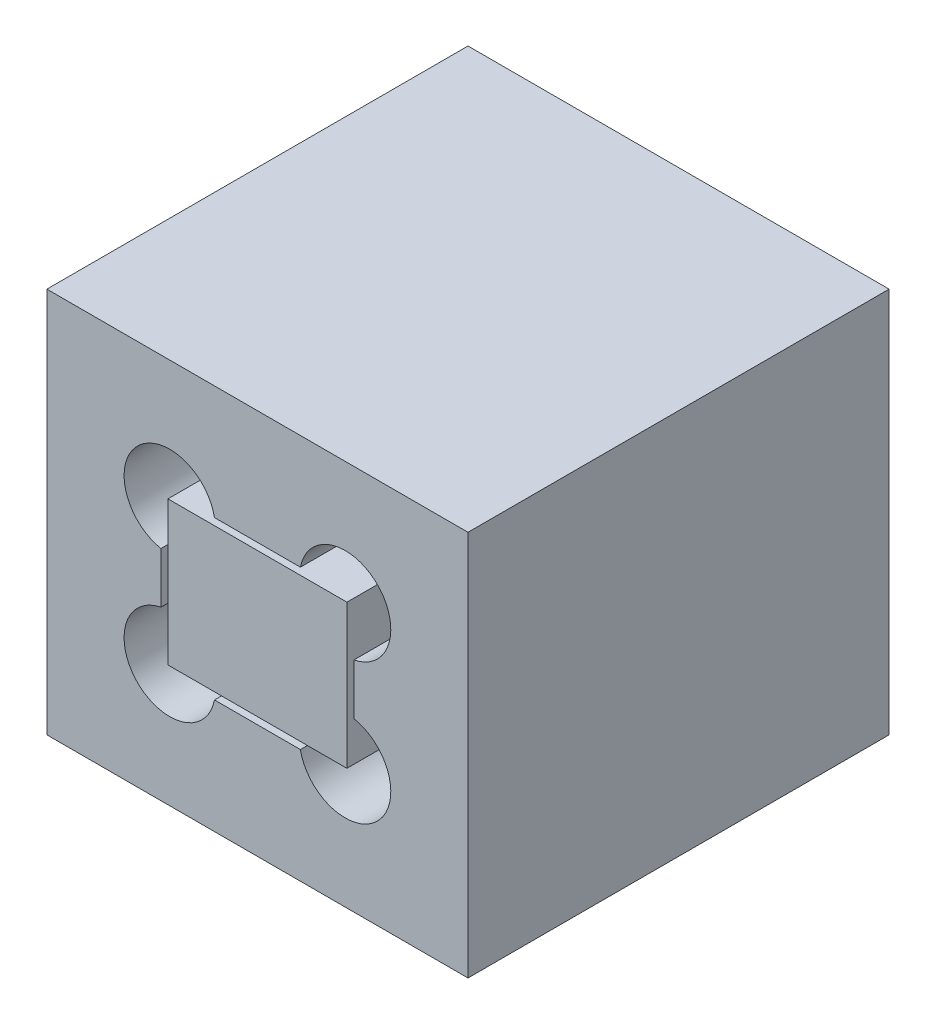
ISO-10303-21;
HEADER;
FILE_DESCRIPTION(('STEP AP214'),'2;1');
FILE_NAME('part.step','',(''),(''),'','','');
FILE_SCHEMA(('AUTOMOTIVE_DESIGN { 1 0 10303 214 1 1 1 1 }'));
ENDSEC;
DATA;
#1=APPLICATION_CONTEXT('core data for automotive mechanical design processes');
#2=APPLICATION_PROTOCOL_DEFINITION('international standard','automotive_design',2000,#1);
#3=PRODUCT_CONTEXT('',#1,'mechanical');
#4=PRODUCT('Part','Part','',(#3));
#5=PRODUCT_RELATED_PRODUCT_CATEGORY('part','',(#4));
#6=PRODUCT_DEFINITION_FORMATION('','',#4);
#7=PRODUCT_DEFINITION_CONTEXT('part definition',#1,'design');
#8=PRODUCT_DEFINITION('design','',#6,#7);
#9=PRODUCT_DEFINITION_SHAPE('','',#8);
#10=(LENGTH_UNIT() NAMED_UNIT(*) SI_UNIT(.MILLI.,.METRE.));
#11=(NAMED_UNIT(*) PLANE_ANGLE_UNIT() SI_UNIT($,.RADIAN.));
#12=(NAMED_UNIT(*) SI_UNIT($,.STERADIAN.) SOLID_ANGLE_UNIT());
#13=UNCERTAINTY_MEASURE_WITH_UNIT(LENGTH_MEASURE(1.E-05),#10,'distance_accuracy_value','');
#14=(GEOMETRIC_REPRESENTATION_CONTEXT(3) GLOBAL_UNCERTAINTY_ASSIGNED_CONTEXT((#13)) GLOBAL_UNIT_ASSIGNED_CONTEXT((#10,
#11,#12)) REPRESENTATION_CONTEXT('',''));
#15=CARTESIAN_POINT('',(0.,0.,0.));
#16=DIRECTION('',(0.,0.,1.));
#17=DIRECTION('',(1.,0.,0.));
#18=AXIS2_PLACEMENT_3D('',#15,#16,#17);
#19=CARTESIAN_POINT('',(3.49999999999996,7.49999999999999,9.50000000000001));
#20=DIRECTION('',(0.,0.,-1.));
#21=DIRECTION('',(-1.,0.,0.));
#22=AXIS2_PLACEMENT_3D('',#19,#20,#21);
#23=PLANE('',#22);
#24=CARTESIAN_POINT('',(3.49999999999996,7.49999999999999,9.50000000000001));
#25=DIRECTION('',(0.,0.,1.));
#26=DIRECTION('',(-1.,0.,0.));
#27=AXIS2_PLACEMENT_3D('',#24,#25,#26);
#28=CIRCLE('',#27,1.3);
#29=CARTESIAN_POINT('',(4.77573508221732,7.74999999999999,9.50000000000001));
#30=VERTEX_POINT('',#29);
#31=CARTESIAN_POINT('',(3.24999999999999,6.22426491778267,9.49999999999998));
#32=VERTEX_POINT('',#31);
#33=EDGE_CURVE('E202',#30,#32,#28,.T.);
#34=ORIENTED_EDGE('',*,*,#33,.T.);
#35=DIRECTION('',(0.,-1.,0.));
#36=VECTOR('',#35,1.);
#37=CARTESIAN_POINT('',(3.24999999999999,4.77573508221731,9.49999999999999));
#38=LINE('',#37,#36);
#39=CARTESIAN_POINT('',(3.24999999999999,4.77573508221731,9.49999999999999));
#40=VERTEX_POINT('',#39);
#41=EDGE_CURVE('E205',#32,#40,#38,.T.);
#42=ORIENTED_EDGE('',*,*,#41,.T.);
#43=CARTESIAN_POINT('',(3.49999999999998,3.5,9.50000000000001));
#44=DIRECTION('',(0.,0.,1.));
#45=DIRECTION('',(1.,0.,0.));
#46=AXIS2_PLACEMENT_3D('',#43,#44,#45);
#47=CIRCLE('',#46,1.3);
#48=CARTESIAN_POINT('',(4.77573508221732,3.24999999999999,9.49999999999999));
#49=VERTEX_POINT('',#48);
#50=EDGE_CURVE('E208',#40,#49,#47,.T.);
#51=ORIENTED_EDGE('',*,*,#50,.T.);
#52=DIRECTION('',(1.,0.,0.));
#53=VECTOR('',#52,1.);
#54=CARTESIAN_POINT('',(7.22426491778269,3.24999999999999,9.49999999999998));
#55=LINE('',#54,#53);
#56=CARTESIAN_POINT('',(7.22426491778269,3.24999999999999,9.49999999999998));
#57=VERTEX_POINT('',#56);
#58=EDGE_CURVE('E211',#49,#57,#55,.T.);
#59=ORIENTED_EDGE('',*,*,#58,.T.);
#60=CARTESIAN_POINT('',(8.49999999999999,3.49999999999999,9.50000000000001));
#61=DIRECTION('',(0.,0.,1.));
#62=DIRECTION('',(-1.,0.,0.));
#63=AXIS2_PLACEMENT_3D('',#60,#61,#62);
#64=CIRCLE('',#63,1.3);
#65=CARTESIAN_POINT('',(8.74999999999999,4.77573508221731,9.50000000000001));
#66=VERTEX_POINT('',#65);
#67=EDGE_CURVE('E214',#57,#66,#64,.T.);
#68=ORIENTED_EDGE('',*,*,#67,.T.);
#69=DIRECTION('',(0.,1.,0.));
#70=VECTOR('',#69,1.);
#71=CARTESIAN_POINT('',(8.74999999999998,6.22426491778268,9.49999999999997));
#72=LINE('',#71,#70);
#73=CARTESIAN_POINT('',(8.74999999999998,6.22426491778268,9.49999999999997));
#74=VERTEX_POINT('',#73);
#75=EDGE_CURVE('E217',#66,#74,#72,.T.);
#76=ORIENTED_EDGE('',*,*,#75,.T.);
#77=CARTESIAN_POINT('',(8.50000000000001,7.49999999999999,9.49999999999999));
#78=DIRECTION('',(0.,0.,1.));
#79=DIRECTION('',(1.,0.,0.));
#80=AXIS2_PLACEMENT_3D('',#77,#78,#79);
#81=CIRCLE('',#80,1.3);
#82=CARTESIAN_POINT('',(7.22426491778269,7.74999999999997,9.50000000000002));
#83=VERTEX_POINT('',#82);
#84=EDGE_CURVE('E220',#74,#83,#81,.T.);
#85=ORIENTED_EDGE('',*,*,#84,.T.);
#86=DIRECTION('',(-1.,0.,0.));
#87=VECTOR('',#86,1.);
#88=CARTESIAN_POINT('',(4.77573508221732,7.74999999999999,9.50000000000001));
#89=LINE('',#88,#87);
#90=EDGE_CURVE('E223',#83,#30,#89,.T.);
#91=ORIENTED_EDGE('',*,*,#90,.T.);
#92=EDGE_LOOP('',(#34,#42,#51,#59,#68,#76,#85,#91));
#93=FACE_BOUND('',#92,.T.);
#94=DIRECTION('',(-1.,0.,0.));
#95=VECTOR('',#94,1.);
#96=CARTESIAN_POINT('',(8.54999999999999,7.54999999999999,9.49999999999998));
#97=LINE('',#96,#95);
#98=CARTESIAN_POINT('',(8.54999999999999,7.54999999999999,9.49999999999998));
#99=VERTEX_POINT('',#98);
#100=CARTESIAN_POINT('',(3.45000000000001,7.54999999999996,9.49999999999999));
#101=VERTEX_POINT('',#100);
#102=EDGE_CURVE('E49',#99,#101,#97,.T.);
#103=ORIENTED_EDGE('',*,*,#102,.F.);
#104=DIRECTION('',(0.,1.,0.));
#105=VECTOR('',#104,1.);
#106=CARTESIAN_POINT('',(8.54999999999999,3.44999999999999,9.49999999999999));
#107=LINE('',#106,#105);
#108=CARTESIAN_POINT('',(8.54999999999999,3.44999999999999,9.49999999999999));
#109=VERTEX_POINT('',#108);
#110=EDGE_CURVE('E54',#109,#99,#107,.T.);
#111=ORIENTED_EDGE('',*,*,#110,.F.);
#112=DIRECTION('',(1.,0.,0.));
#113=VECTOR('',#112,1.);
#114=CARTESIAN_POINT('',(3.45000000000001,3.44999999999999,9.50000000000001));
#115=LINE('',#114,#113);
#116=CARTESIAN_POINT('',(3.45000000000001,3.44999999999999,9.50000000000001));
#117=VERTEX_POINT('',#116);
#118=EDGE_CURVE('E144',#117,#109,#115,.T.);
#119=ORIENTED_EDGE('',*,*,#118,.F.);
#120=DIRECTION('',(0.,-1.,0.));
#121=VECTOR('',#120,1.);
#122=CARTESIAN_POINT('',(3.45000000000001,7.54999999999996,9.49999999999999));
#123=LINE('',#122,#121);
#124=EDGE_CURVE('E147',#101,#117,#123,.T.);
#125=ORIENTED_EDGE('',*,*,#124,.F.);
#126=EDGE_LOOP('',(#103,#111,#119,#125));
#127=FACE_BOUND('',#126,.T.);
#128=ADVANCED_FACE('F34',(#93,#127),#23,.F.);
#129=CARTESIAN_POINT('',(0.,0.,12.));
#130=DIRECTION('',(1.,0.,0.));
#131=DIRECTION('',(0.,1.,0.));
#132=AXIS2_PLACEMENT_3D('',#129,#130,#131);
#133=PLANE('',#132);
#134=DIRECTION('',(0.,-1.,0.));
#135=VECTOR('',#134,1.);
#136=CARTESIAN_POINT('',(0.,0.,0.));
#137=LINE('',#136,#135);
#138=CARTESIAN_POINT('',(0.,11.,0.));
#139=VERTEX_POINT('',#138);
#140=CARTESIAN_POINT('',(0.,0.,0.));
#141=VERTEX_POINT('',#140);
#142=EDGE_CURVE('E229',#139,#141,#137,.T.);
#143=ORIENTED_EDGE('',*,*,#142,.T.);
#144=DIRECTION('',(0.,0.,-1.));
#145=VECTOR('',#144,1.);
#146=CARTESIAN_POINT('',(0.,0.,12.));
#147=LINE('',#146,#145);
#148=CARTESIAN_POINT('',(0.,0.,12.));
#149=VERTEX_POINT('',#148);
#150=EDGE_CURVE('E11',#149,#141,#147,.T.);
#151=ORIENTED_EDGE('',*,*,#150,.F.);
#152=DIRECTION('',(0.,-1.,0.));
#153=VECTOR('',#152,1.);
#154=CARTESIAN_POINT('',(0.,0.,12.));
#155=LINE('',#154,#153);
#156=CARTESIAN_POINT('',(0.,11.,12.));
#157=VERTEX_POINT('',#156);
#158=EDGE_CURVE('E252',#157,#149,#155,.T.);
#159=ORIENTED_EDGE('',*,*,#158,.F.);
#160=DIRECTION('',(0.,0.,-1.));
#161=VECTOR('',#160,1.);
#162=CARTESIAN_POINT('',(0.,11.,12.));
#163=LINE('',#162,#161);
#164=EDGE_CURVE('E261',#157,#139,#163,.T.);
#165=ORIENTED_EDGE('',*,*,#164,.T.);
#166=EDGE_LOOP('',(#143,#151,#159,#165));
#167=FACE_BOUND('',#166,.T.);
#168=ADVANCED_FACE('F36',(#167),#133,.F.);
#169=CARTESIAN_POINT('',(0.,0.,12.));
#170=DIRECTION('',(0.,1.,0.));
#171=DIRECTION('',(0.,0.,1.));
#172=AXIS2_PLACEMENT_3D('',#169,#170,#171);
#173=PLANE('',#172);
#174=DIRECTION('',(1.,0.,0.));
#175=VECTOR('',#174,1.);
#176=CARTESIAN_POINT('',(0.,0.,0.));
#177=LINE('',#176,#175);
#178=CARTESIAN_POINT('',(12.,0.,0.));
#179=VERTEX_POINT('',#178);
#180=EDGE_CURVE('E246',#141,#179,#177,.T.);
#181=ORIENTED_EDGE('',*,*,#180,.T.);
#182=DIRECTION('',(0.,0.,-1.));
#183=VECTOR('',#182,1.);
#184=CARTESIAN_POINT('',(12.,0.,12.));
#185=LINE('',#184,#183);
#186=CARTESIAN_POINT('',(12.,0.,12.));
#187=VERTEX_POINT('',#186);
#188=EDGE_CURVE('E42',#187,#179,#185,.T.);
#189=ORIENTED_EDGE('',*,*,#188,.F.);
#190=DIRECTION('',(1.,0.,0.));
#191=VECTOR('',#190,1.);
#192=CARTESIAN_POINT('',(0.,0.,12.));
#193=LINE('',#192,#191);
#194=EDGE_CURVE('E255',#149,#187,#193,.T.);
#195=ORIENTED_EDGE('',*,*,#194,.F.);
#196=ORIENTED_EDGE('',*,*,#150,.T.);
#197=EDGE_LOOP('',(#181,#189,#195,#196));
#198=FACE_BOUND('',#197,.T.);
#199=ADVANCED_FACE('F287',(#198),#173,.F.);
#200=CARTESIAN_POINT('',(12.,0.,12.));
#201=DIRECTION('',(-1.,0.,0.));
#202=DIRECTION('',(0.,-1.,0.));
#203=AXIS2_PLACEMENT_3D('',#200,#201,#202);
#204=PLANE('',#203);
#205=DIRECTION('',(0.,1.,0.));
#206=VECTOR('',#205,1.);
#207=CARTESIAN_POINT('',(12.,0.,0.));
#208=LINE('',#207,#206);
#209=CARTESIAN_POINT('',(12.,11.,0.));
#210=VERTEX_POINT('',#209);
#211=EDGE_CURVE('E248',#179,#210,#208,.T.);
#212=ORIENTED_EDGE('',*,*,#211,.T.);
#213=DIRECTION('',(0.,0.,-1.));
#214=VECTOR('',#213,1.);
#215=CARTESIAN_POINT('',(12.,11.,12.));
#216=LINE('',#215,#214);
#217=CARTESIAN_POINT('',(12.,11.,12.));
#218=VERTEX_POINT('',#217);
#219=EDGE_CURVE('E264',#218,#210,#216,.T.);
#220=ORIENTED_EDGE('',*,*,#219,.F.);
#221=DIRECTION('',(0.,1.,0.));
#222=VECTOR('',#221,1.);
#223=CARTESIAN_POINT('',(12.,0.,12.));
#224=LINE('',#223,#222);
#225=EDGE_CURVE('E257',#187,#218,#224,.T.);
#226=ORIENTED_EDGE('',*,*,#225,.F.);
#227=ORIENTED_EDGE('',*,*,#188,.T.);
#228=EDGE_LOOP('',(#212,#220,#226,#227));
#229=FACE_BOUND('',#228,.T.);
#230=ADVANCED_FACE('F271',(#229),#204,.F.);
#231=CARTESIAN_POINT('',(0.,11.,12.));
#232=DIRECTION('',(0.,-1.,0.));
#233=DIRECTION('',(0.,0.,-1.));
#234=AXIS2_PLACEMENT_3D('',#231,#232,#233);
#235=PLANE('',#234);
#236=DIRECTION('',(-1.,0.,0.));
#237=VECTOR('',#236,1.);
#238=CARTESIAN_POINT('',(0.,11.,0.));
#239=LINE('',#238,#237);
#240=EDGE_CURVE('E250',#210,#139,#239,.T.);
#241=ORIENTED_EDGE('',*,*,#240,.T.);
#242=ORIENTED_EDGE('',*,*,#164,.F.);
#243=DIRECTION('',(-1.,0.,0.));
#244=VECTOR('',#243,1.);
#245=CARTESIAN_POINT('',(0.,11.,12.));
#246=LINE('',#245,#244);
#247=EDGE_CURVE('E259',#218,#157,#246,.T.);
#248=ORIENTED_EDGE('',*,*,#247,.F.);
#249=ORIENTED_EDGE('',*,*,#219,.T.);
#250=EDGE_LOOP('',(#241,#242,#248,#249));
#251=FACE_BOUND('',#250,.T.);
#252=ADVANCED_FACE('F280',(#251),#235,.F.);
#253=CARTESIAN_POINT('',(0.,11.,12.));
#254=DIRECTION('',(0.,0.,-1.));
#255=DIRECTION('',(-1.,0.,0.));
#256=AXIS2_PLACEMENT_3D('',#253,#254,#255);
#257=PLANE('',#256);
#258=DIRECTION('',(0.,-1.,0.));
#259=VECTOR('',#258,1.);
#260=CARTESIAN_POINT('',(3.24999999999999,4.77573508221729,12.));
#261=LINE('',#260,#259);
#262=CARTESIAN_POINT('',(3.24999999999999,6.22426491778265,12.));
#263=VERTEX_POINT('',#262);
#264=CARTESIAN_POINT('',(3.24999999999999,4.77573508221729,12.));
#265=VERTEX_POINT('',#264);
#266=EDGE_CURVE('E181',#263,#265,#261,.T.);
#267=ORIENTED_EDGE('',*,*,#266,.F.);
#268=CARTESIAN_POINT('',(3.49999999999999,7.49999999999999,12.));
#269=DIRECTION('',(0.,0.,1.));
#270=DIRECTION('',(-1.,0.,0.));
#271=AXIS2_PLACEMENT_3D('',#268,#269,#270);
#272=CIRCLE('',#271,1.3);
#273=CARTESIAN_POINT('',(4.77573508221732,7.74999999999997,12.));
#274=VERTEX_POINT('',#273);
#275=EDGE_CURVE('E179',#274,#263,#272,.T.);
#276=ORIENTED_EDGE('',*,*,#275,.F.);
#277=DIRECTION('',(-1.,0.,0.));
#278=VECTOR('',#277,1.);
#279=CARTESIAN_POINT('',(4.77573508221732,7.74999999999997,12.));
#280=LINE('',#279,#278);
#281=CARTESIAN_POINT('',(7.22426491778272,7.74999999999999,12.));
#282=VERTEX_POINT('',#281);
#283=EDGE_CURVE('E199',#282,#274,#280,.T.);
#284=ORIENTED_EDGE('',*,*,#283,.F.);
#285=CARTESIAN_POINT('',(8.50000000000001,7.49999999999999,12.));
#286=DIRECTION('',(0.,0.,1.));
#287=DIRECTION('',(1.,0.,0.));
#288=AXIS2_PLACEMENT_3D('',#285,#286,#287);
#289=CIRCLE('',#288,1.3);
#290=CARTESIAN_POINT('',(8.74999999999998,6.22426491778267,12.));
#291=VERTEX_POINT('',#290);
#292=EDGE_CURVE('E196',#291,#282,#289,.T.);
#293=ORIENTED_EDGE('',*,*,#292,.F.);
#294=DIRECTION('',(0.,1.,0.));
#295=VECTOR('',#294,1.);
#296=CARTESIAN_POINT('',(8.74999999999998,6.22426491778267,12.));
#297=LINE('',#296,#295);
#298=CARTESIAN_POINT('',(8.74999999999999,4.77573508221731,12.));
#299=VERTEX_POINT('',#298);
#300=EDGE_CURVE('E193',#299,#291,#297,.T.);
#301=ORIENTED_EDGE('',*,*,#300,.F.);
#302=CARTESIAN_POINT('',(8.49999999999999,3.5,12.));
#303=DIRECTION('',(0.,0.,1.));
#304=DIRECTION('',(-1.,0.,0.));
#305=AXIS2_PLACEMENT_3D('',#302,#303,#304);
#306=CIRCLE('',#305,1.3);
#307=CARTESIAN_POINT('',(7.22426491778272,3.24999999999998,12.));
#308=VERTEX_POINT('',#307);
#309=EDGE_CURVE('E190',#308,#299,#306,.T.);
#310=ORIENTED_EDGE('',*,*,#309,.F.);
#311=DIRECTION('',(1.,0.,0.));
#312=VECTOR('',#311,1.);
#313=CARTESIAN_POINT('',(7.22426491778272,3.24999999999998,12.));
#314=LINE('',#313,#312);
#315=CARTESIAN_POINT('',(4.77573508221732,3.25,12.));
#316=VERTEX_POINT('',#315);
#317=EDGE_CURVE('E187',#316,#308,#314,.T.);
#318=ORIENTED_EDGE('',*,*,#317,.F.);
#319=CARTESIAN_POINT('',(3.5,3.49999999999999,12.));
#320=DIRECTION('',(0.,0.,1.));
#321=DIRECTION('',(1.,0.,0.));
#322=AXIS2_PLACEMENT_3D('',#319,#320,#321);
#323=CIRCLE('',#322,1.3);
#324=EDGE_CURVE('E184',#265,#316,#323,.T.);
#325=ORIENTED_EDGE('',*,*,#324,.F.);
#326=EDGE_LOOP('',(#267,#276,#284,#293,#301,#310,#318,#325));
#327=FACE_BOUND('',#326,.T.);
#328=ORIENTED_EDGE('',*,*,#158,.T.);
#329=ORIENTED_EDGE('',*,*,#194,.T.);
#330=ORIENTED_EDGE('',*,*,#225,.T.);
#331=ORIENTED_EDGE('',*,*,#247,.T.);
#332=EDGE_LOOP('',(#328,#329,#330,#331));
#333=FACE_BOUND('',#332,.T.);
#334=ADVANCED_FACE('F286',(#327,#333),#257,.F.);
#335=CARTESIAN_POINT('',(0.,11.,0.));
#336=DIRECTION('',(0.,0.,-1.));
#337=DIRECTION('',(-1.,0.,0.));
#338=AXIS2_PLACEMENT_3D('',#335,#336,#337);
#339=PLANE('',#338);
#340=ORIENTED_EDGE('',*,*,#142,.F.);
#341=ORIENTED_EDGE('',*,*,#240,.F.);
#342=ORIENTED_EDGE('',*,*,#211,.F.);
#343=ORIENTED_EDGE('',*,*,#180,.F.);
#344=EDGE_LOOP('',(#340,#341,#342,#343));
#345=FACE_BOUND('',#344,.T.);
#346=ADVANCED_FACE('F277',(#345),#339,.T.);
#347=CARTESIAN_POINT('',(3.49999999999996,7.49999999999999,9.50000000000001));
#348=DIRECTION('',(0.,0.,1.));
#349=DIRECTION('',(1.,0.,0.));
#350=AXIS2_PLACEMENT_3D('',#347,#348,#349);
#351=CYLINDRICAL_SURFACE('',#350,1.3);
#352=ORIENTED_EDGE('',*,*,#275,.T.);
#353=DIRECTION('',(0.,0.,1.));
#354=VECTOR('',#353,1.);
#355=CARTESIAN_POINT('',(3.24999999999999,6.22426491778267,9.49999999999998));
#356=LINE('',#355,#354);
#357=EDGE_CURVE('E226',#32,#263,#356,.T.);
#358=ORIENTED_EDGE('',*,*,#357,.F.);
#359=ORIENTED_EDGE('',*,*,#33,.F.);
#360=DIRECTION('',(0.,0.,1.));
#361=VECTOR('',#360,1.);
#362=CARTESIAN_POINT('',(4.77573508221732,7.74999999999999,9.50000000000001));
#363=LINE('',#362,#361);
#364=EDGE_CURVE('E227',#30,#274,#363,.T.);
#365=ORIENTED_EDGE('',*,*,#364,.T.);
#366=EDGE_LOOP('',(#352,#358,#359,#365));
#367=FACE_BOUND('',#366,.T.);
#368=ADVANCED_FACE('F306',(#367),#351,.F.);
#369=CARTESIAN_POINT('',(4.77573508221732,7.74999999999999,9.50000000000001));
#370=DIRECTION('',(0.,1.,0.));
#371=DIRECTION('',(-1.,0.,0.));
#372=AXIS2_PLACEMENT_3D('',#369,#370,#371);
#373=PLANE('',#372);
#374=ORIENTED_EDGE('',*,*,#283,.T.);
#375=ORIENTED_EDGE('',*,*,#364,.F.);
#376=ORIENTED_EDGE('',*,*,#90,.F.);
#377=DIRECTION('',(0.,0.,1.));
#378=VECTOR('',#377,1.);
#379=CARTESIAN_POINT('',(7.22426491778269,7.74999999999997,9.50000000000002));
#380=LINE('',#379,#378);
#381=EDGE_CURVE('E230',#83,#282,#380,.T.);
#382=ORIENTED_EDGE('',*,*,#381,.T.);
#383=EDGE_LOOP('',(#374,#375,#376,#382));
#384=FACE_BOUND('',#383,.T.);
#385=ADVANCED_FACE('F302',(#384),#373,.F.);
#386=CARTESIAN_POINT('',(8.50000000000001,7.49999999999999,9.49999999999999));
#387=DIRECTION('',(0.,0.,1.));
#388=DIRECTION('',(1.,0.,0.));
#389=AXIS2_PLACEMENT_3D('',#386,#387,#388);
#390=CYLINDRICAL_SURFACE('',#389,1.3);
#391=ORIENTED_EDGE('',*,*,#292,.T.);
#392=ORIENTED_EDGE('',*,*,#381,.F.);
#393=ORIENTED_EDGE('',*,*,#84,.F.);
#394=DIRECTION('',(0.,0.,1.));
#395=VECTOR('',#394,1.);
#396=CARTESIAN_POINT('',(8.74999999999998,6.22426491778268,9.49999999999997));
#397=LINE('',#396,#395);
#398=EDGE_CURVE('E232',#74,#291,#397,.T.);
#399=ORIENTED_EDGE('',*,*,#398,.T.);
#400=EDGE_LOOP('',(#391,#392,#393,#399));
#401=FACE_BOUND('',#400,.T.);
#402=ADVANCED_FACE('F305',(#401),#390,.F.);
#403=CARTESIAN_POINT('',(8.74999999999998,6.22426491778268,9.49999999999997));
#404=DIRECTION('',(1.,0.,0.));
#405=DIRECTION('',(0.,1.,0.));
#406=AXIS2_PLACEMENT_3D('',#403,#404,#405);
#407=PLANE('',#406);
#408=ORIENTED_EDGE('',*,*,#300,.T.);
#409=ORIENTED_EDGE('',*,*,#398,.F.);
#410=ORIENTED_EDGE('',*,*,#75,.F.);
#411=DIRECTION('',(0.,0.,1.));
#412=VECTOR('',#411,1.);
#413=CARTESIAN_POINT('',(8.74999999999999,4.77573508221731,9.50000000000001));
#414=LINE('',#413,#412);
#415=EDGE_CURVE('E234',#66,#299,#414,.T.);
#416=ORIENTED_EDGE('',*,*,#415,.T.);
#417=EDGE_LOOP('',(#408,#409,#410,#416));
#418=FACE_BOUND('',#417,.T.);
#419=ADVANCED_FACE('F310',(#418),#407,.F.);
#420=CARTESIAN_POINT('',(8.49999999999999,3.49999999999999,9.50000000000001));
#421=DIRECTION('',(0.,0.,1.));
#422=DIRECTION('',(1.,0.,0.));
#423=AXIS2_PLACEMENT_3D('',#420,#421,#422);
#424=CYLINDRICAL_SURFACE('',#423,1.3);
#425=ORIENTED_EDGE('',*,*,#309,.T.);
#426=ORIENTED_EDGE('',*,*,#415,.F.);
#427=ORIENTED_EDGE('',*,*,#67,.F.);
#428=DIRECTION('',(0.,0.,1.));
#429=VECTOR('',#428,1.);
#430=CARTESIAN_POINT('',(7.22426491778269,3.24999999999999,9.49999999999998));
#431=LINE('',#430,#429);
#432=EDGE_CURVE('E236',#57,#308,#431,.T.);
#433=ORIENTED_EDGE('',*,*,#432,.T.);
#434=EDGE_LOOP('',(#425,#426,#427,#433));
#435=FACE_BOUND('',#434,.T.);
#436=ADVANCED_FACE('F314',(#435),#424,.F.);
#437=CARTESIAN_POINT('',(7.22426491778269,3.24999999999999,9.49999999999998));
#438=DIRECTION('',(0.,-1.,0.));
#439=DIRECTION('',(1.,0.,0.));
#440=AXIS2_PLACEMENT_3D('',#437,#438,#439);
#441=PLANE('',#440);
#442=ORIENTED_EDGE('',*,*,#317,.T.);
#443=ORIENTED_EDGE('',*,*,#432,.F.);
#444=ORIENTED_EDGE('',*,*,#58,.F.);
#445=DIRECTION('',(0.,0.,1.));
#446=VECTOR('',#445,1.);
#447=CARTESIAN_POINT('',(4.77573508221732,3.24999999999999,9.49999999999999));
#448=LINE('',#447,#446);
#449=EDGE_CURVE('E238',#49,#316,#448,.T.);
#450=ORIENTED_EDGE('',*,*,#449,.T.);
#451=EDGE_LOOP('',(#442,#443,#444,#450));
#452=FACE_BOUND('',#451,.T.);
#453=ADVANCED_FACE('F318',(#452),#441,.F.);
#454=CARTESIAN_POINT('',(3.49999999999998,3.5,9.50000000000001));
#455=DIRECTION('',(0.,0.,1.));
#456=DIRECTION('',(1.,0.,0.));
#457=AXIS2_PLACEMENT_3D('',#454,#455,#456);
#458=CYLINDRICAL_SURFACE('',#457,1.3);
#459=ORIENTED_EDGE('',*,*,#324,.T.);
#460=ORIENTED_EDGE('',*,*,#449,.F.);
#461=ORIENTED_EDGE('',*,*,#50,.F.);
#462=DIRECTION('',(0.,0.,1.));
#463=VECTOR('',#462,1.);
#464=CARTESIAN_POINT('',(3.24999999999999,4.77573508221731,9.49999999999999));
#465=LINE('',#464,#463);
#466=EDGE_CURVE('E240',#40,#265,#465,.T.);
#467=ORIENTED_EDGE('',*,*,#466,.T.);
#468=EDGE_LOOP('',(#459,#460,#461,#467));
#469=FACE_BOUND('',#468,.T.);
#470=ADVANCED_FACE('F322',(#469),#458,.F.);
#471=CARTESIAN_POINT('',(3.24999999999999,4.77573508221731,9.49999999999999));
#472=DIRECTION('',(-1.,0.,0.));
#473=DIRECTION('',(0.,-1.,0.));
#474=AXIS2_PLACEMENT_3D('',#471,#472,#473);
#475=PLANE('',#474);
#476=ORIENTED_EDGE('',*,*,#266,.T.);
#477=ORIENTED_EDGE('',*,*,#466,.F.);
#478=ORIENTED_EDGE('',*,*,#41,.F.);
#479=ORIENTED_EDGE('',*,*,#357,.T.);
#480=EDGE_LOOP('',(#476,#477,#478,#479));
#481=FACE_BOUND('',#480,.T.);
#482=ADVANCED_FACE('F326',(#481),#475,.F.);
#483=CARTESIAN_POINT('',(8.55,7.54999999999999,18.5436992595932));
#484=DIRECTION('',(0.,-1.,0.));
#485=DIRECTION('',(0.,0.,-1.));
#486=AXIS2_PLACEMENT_3D('',#483,#484,#485);
#487=PLANE('',#486);
#488=DIRECTION('',(0.,0.,-1.));
#489=VECTOR('',#488,1.);
#490=CARTESIAN_POINT('',(3.45000000000002,7.54999999999998,18.5436992595932));
#491=LINE('',#490,#489);
#492=CARTESIAN_POINT('',(3.45000000000001,7.54999999999999,12.));
#493=VERTEX_POINT('',#492);
#494=EDGE_CURVE('E164',#493,#101,#491,.T.);
#495=ORIENTED_EDGE('',*,*,#494,.F.);
#496=DIRECTION('',(1.,0.,0.));
#497=VECTOR('',#496,1.);
#498=CARTESIAN_POINT('',(8.54999999999999,7.54999999999999,12.));
#499=LINE('',#498,#497);
#500=CARTESIAN_POINT('',(8.54999999999999,7.54999999999999,12.));
#501=VERTEX_POINT('',#500);
#502=EDGE_CURVE('E159',#493,#501,#499,.T.);
#503=ORIENTED_EDGE('',*,*,#502,.T.);
#504=DIRECTION('',(0.,0.,-1.));
#505=VECTOR('',#504,1.);
#506=CARTESIAN_POINT('',(8.55,7.54999999999999,18.5436992595932));
#507=LINE('',#506,#505);
#508=EDGE_CURVE('E173',#501,#99,#507,.T.);
#509=ORIENTED_EDGE('',*,*,#508,.T.);
#510=ORIENTED_EDGE('',*,*,#102,.T.);
#511=EDGE_LOOP('',(#495,#503,#509,#510));
#512=FACE_BOUND('',#511,.T.);
#513=ADVANCED_FACE('F330',(#512),#487,.F.);
#514=CARTESIAN_POINT('',(8.55,3.44999999999999,18.5436992595932));
#515=DIRECTION('',(-1.,0.,0.));
#516=DIRECTION('',(0.,0.,1.));
#517=AXIS2_PLACEMENT_3D('',#514,#515,#516);
#518=PLANE('',#517);
#519=ORIENTED_EDGE('',*,*,#508,.F.);
#520=DIRECTION('',(0.,-1.,0.));
#521=VECTOR('',#520,1.);
#522=CARTESIAN_POINT('',(8.54999999999999,3.44999999999998,12.));
#523=LINE('',#522,#521);
#524=CARTESIAN_POINT('',(8.54999999999999,3.44999999999998,12.));
#525=VERTEX_POINT('',#524);
#526=EDGE_CURVE('E178',#501,#525,#523,.T.);
#527=ORIENTED_EDGE('',*,*,#526,.T.);
#528=DIRECTION('',(0.,0.,-1.));
#529=VECTOR('',#528,1.);
#530=CARTESIAN_POINT('',(8.55,3.44999999999999,18.5436992595932));
#531=LINE('',#530,#529);
#532=EDGE_CURVE('E160',#525,#109,#531,.T.);
#533=ORIENTED_EDGE('',*,*,#532,.T.);
#534=ORIENTED_EDGE('',*,*,#110,.T.);
#535=EDGE_LOOP('',(#519,#527,#533,#534));
#536=FACE_BOUND('',#535,.T.);
#537=ADVANCED_FACE('F391',(#536),#518,.F.);
#538=CARTESIAN_POINT('',(3.45000000000002,3.44999999999999,18.5436992595932));
#539=DIRECTION('',(0.,1.,0.));
#540=DIRECTION('',(-1.,0.,0.));
#541=AXIS2_PLACEMENT_3D('',#538,#539,#540);
#542=PLANE('',#541);
#543=ORIENTED_EDGE('',*,*,#532,.F.);
#544=DIRECTION('',(-1.,0.,0.));
#545=VECTOR('',#544,1.);
#546=CARTESIAN_POINT('',(3.45000000000001,3.44999999999998,12.));
#547=LINE('',#546,#545);
#548=CARTESIAN_POINT('',(3.45000000000001,3.44999999999998,12.));
#549=VERTEX_POINT('',#548);
#550=EDGE_CURVE('E156',#525,#549,#547,.T.);
#551=ORIENTED_EDGE('',*,*,#550,.T.);
#552=DIRECTION('',(0.,0.,-1.));
#553=VECTOR('',#552,1.);
#554=CARTESIAN_POINT('',(3.45000000000002,3.44999999999999,18.5436992595932));
#555=LINE('',#554,#553);
#556=EDGE_CURVE('E154',#549,#117,#555,.T.);
#557=ORIENTED_EDGE('',*,*,#556,.T.);
#558=ORIENTED_EDGE('',*,*,#118,.T.);
#559=EDGE_LOOP('',(#543,#551,#557,#558));
#560=FACE_BOUND('',#559,.T.);
#561=ADVANCED_FACE('F155',(#560),#542,.F.);
#562=CARTESIAN_POINT('',(3.45000000000002,7.54999999999998,18.5436992595932));
#563=DIRECTION('',(1.,0.,0.));
#564=DIRECTION('',(0.,1.,0.));
#565=AXIS2_PLACEMENT_3D('',#562,#563,#564);
#566=PLANE('',#565);
#567=ORIENTED_EDGE('',*,*,#556,.F.);
#568=DIRECTION('',(0.,1.,0.));
#569=VECTOR('',#568,1.);
#570=CARTESIAN_POINT('',(3.45000000000001,7.54999999999999,12.));
#571=LINE('',#570,#569);
#572=EDGE_CURVE('E167',#549,#493,#571,.T.);
#573=ORIENTED_EDGE('',*,*,#572,.T.);
#574=ORIENTED_EDGE('',*,*,#494,.T.);
#575=ORIENTED_EDGE('',*,*,#124,.T.);
#576=EDGE_LOOP('',(#567,#573,#574,#575));
#577=FACE_BOUND('',#576,.T.);
#578=ADVANCED_FACE('F162',(#577),#566,.F.);
#579=CARTESIAN_POINT('',(0.,11.,12.));
#580=DIRECTION('',(0.,0.,-1.));
#581=DIRECTION('',(-1.,0.,0.));
#582=AXIS2_PLACEMENT_3D('',#579,#580,#581);
#583=PLANE('',#582);
#584=ORIENTED_EDGE('',*,*,#550,.F.);
#585=ORIENTED_EDGE('',*,*,#526,.F.);
#586=ORIENTED_EDGE('',*,*,#502,.F.);
#587=ORIENTED_EDGE('',*,*,#572,.F.);
#588=EDGE_LOOP('',(#584,#585,#586,#587));
#589=FACE_BOUND('',#588,.T.);
#590=ADVANCED_FACE('F411',(#589),#583,.F.);
#591=CLOSED_SHELL('',(#128,#168,#199,#230,#252,#334,#346,#368,#385,#402,#419,#436,#453,#470,
#482,#513,#537,#561,#578,#590));
#592=MANIFOLD_SOLID_BREP('B2',#591);
#593=ADVANCED_BREP_SHAPE_REPRESENTATION('',(#18,#592),#14);
#594=SHAPE_DEFINITION_REPRESENTATION(#9,#593);
ENDSEC;
END-ISO-10303-21;
